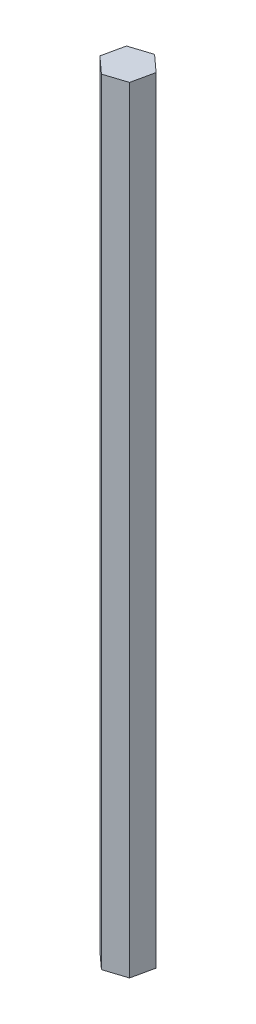
ISO-10303-21;
HEADER;
FILE_DESCRIPTION(('STEP AP214'),'2;1');
FILE_NAME('part.step','',(''),(''),'','','');
FILE_SCHEMA(('AUTOMOTIVE_DESIGN { 1 0 10303 214 1 1 1 1 }'));
ENDSEC;
DATA;
#1=APPLICATION_CONTEXT('core data for automotive mechanical design processes');
#2=APPLICATION_PROTOCOL_DEFINITION('international standard','automotive_design',2000,#1);
#3=PRODUCT_CONTEXT('',#1,'mechanical');
#4=PRODUCT('Part','Part','',(#3));
#5=PRODUCT_RELATED_PRODUCT_CATEGORY('part','',(#4));
#6=PRODUCT_DEFINITION_FORMATION('','',#4);
#7=PRODUCT_DEFINITION_CONTEXT('part definition',#1,'design');
#8=PRODUCT_DEFINITION('design','',#6,#7);
#9=PRODUCT_DEFINITION_SHAPE('','',#8);
#10=(LENGTH_UNIT() NAMED_UNIT(*) SI_UNIT(.MILLI.,.METRE.));
#11=(NAMED_UNIT(*) PLANE_ANGLE_UNIT() SI_UNIT($,.RADIAN.));
#12=(NAMED_UNIT(*) SI_UNIT($,.STERADIAN.) SOLID_ANGLE_UNIT());
#13=UNCERTAINTY_MEASURE_WITH_UNIT(LENGTH_MEASURE(1.E-05),#10,'distance_accuracy_value','');
#14=(GEOMETRIC_REPRESENTATION_CONTEXT(3) GLOBAL_UNCERTAINTY_ASSIGNED_CONTEXT((#13)) GLOBAL_UNIT_ASSIGNED_CONTEXT((#10,
#11,#12)) REPRESENTATION_CONTEXT('',''));
#15=CARTESIAN_POINT('',(0.,0.,0.));
#16=DIRECTION('',(0.,0.,1.));
#17=DIRECTION('',(1.,0.,0.));
#18=AXIS2_PLACEMENT_3D('',#15,#16,#17);
#19=CARTESIAN_POINT('',(-0.61182187926995,127.,2.82117126764399));
#20=DIRECTION('',(-0.305094633460301,0.,-0.952322038300976));
#21=DIRECTION('',(-0.952322038300976,0.,0.305094633460301));
#22=AXIS2_PLACEMENT_3D('',#19,#20,#21);
#23=PLANE('',#22);
#24=DIRECTION('',(0.,-1.,0.));
#25=VECTOR('',#24,1.);
#26=CARTESIAN_POINT('',(-0.61182187926995,127.,2.82117126764399));
#27=LINE('',#26,#25);
#28=CARTESIAN_POINT('',(-0.61182187926995,127.,2.82117126764399));
#29=VERTEX_POINT('',#28);
#30=CARTESIAN_POINT('',(-0.611821879270068,26.74,2.82117126764397));
#31=VERTEX_POINT('',#30);
#32=EDGE_CURVE('E148',#29,#31,#27,.T.);
#33=ORIENTED_EDGE('',*,*,#32,.T.);
#34=DIRECTION('',(-0.952322038300988,0.,0.305094633460263));
#35=VECTOR('',#34,1.);
#36=CARTESIAN_POINT('',(2.13729504657139,26.74,1.940438923861));
#37=LINE('',#36,#35);
#38=CARTESIAN_POINT('',(2.13729504657139,26.74,1.940438923861));
#39=VERTEX_POINT('',#38);
#40=EDGE_CURVE('E124',#39,#31,#37,.T.);
#41=ORIENTED_EDGE('',*,*,#40,.F.);
#42=DIRECTION('',(0.,-1.,0.));
#43=VECTOR('',#42,1.);
#44=CARTESIAN_POINT('',(2.13729504657146,127.,1.94043892386091));
#45=LINE('',#44,#43);
#46=CARTESIAN_POINT('',(2.13729504657146,127.,1.94043892386091));
#47=VERTEX_POINT('',#46);
#48=EDGE_CURVE('E11',#47,#39,#45,.T.);
#49=ORIENTED_EDGE('',*,*,#48,.F.);
#50=DIRECTION('',(0.952322038300976,0.,-0.305094633460301));
#51=VECTOR('',#50,1.);
#52=CARTESIAN_POINT('',(-0.61182187926995,127.,2.82117126764399));
#53=LINE('',#52,#51);
#54=EDGE_CURVE('E133',#29,#47,#53,.T.);
#55=ORIENTED_EDGE('',*,*,#54,.F.);
#56=EDGE_LOOP('',(#33,#41,#49,#55));
#57=FACE_BOUND('',#56,.T.);
#58=ADVANCED_FACE('F39',(#57),#23,.F.);
#59=CARTESIAN_POINT('',(2.13729504657146,127.,1.94043892386091));
#60=DIRECTION('',(-0.977282394482572,0.,-0.211941316015566));
#61=DIRECTION('',(-0.211941316015566,0.,0.977282394482572));
#62=AXIS2_PLACEMENT_3D('',#59,#60,#61);
#63=PLANE('',#62);
#64=ORIENTED_EDGE('',*,*,#48,.T.);
#65=DIRECTION('',(-0.211941316015604,0.,0.977282394482564));
#66=VECTOR('',#65,1.);
#67=CARTESIAN_POINT('',(2.74911692584146,26.74,-0.88073234378297));
#68=LINE('',#67,#66);
#69=CARTESIAN_POINT('',(2.74911692584146,26.74,-0.88073234378297));
#70=VERTEX_POINT('',#69);
#71=EDGE_CURVE('E112',#70,#39,#68,.T.);
#72=ORIENTED_EDGE('',*,*,#71,.F.);
#73=DIRECTION('',(0.,-1.,0.));
#74=VECTOR('',#73,1.);
#75=CARTESIAN_POINT('',(2.74911692584142,127.,-0.880732343783076));
#76=LINE('',#75,#74);
#77=CARTESIAN_POINT('',(2.74911692584142,127.,-0.880732343783076));
#78=VERTEX_POINT('',#77);
#79=EDGE_CURVE('E47',#78,#70,#76,.T.);
#80=ORIENTED_EDGE('',*,*,#79,.F.);
#81=DIRECTION('',(0.211941316015566,0.,-0.977282394482572));
#82=VECTOR('',#81,1.);
#83=CARTESIAN_POINT('',(2.13729504657146,127.,1.94043892386091));
#84=LINE('',#83,#82);
#85=EDGE_CURVE('E136',#47,#78,#84,.T.);
#86=ORIENTED_EDGE('',*,*,#85,.F.);
#87=EDGE_LOOP('',(#64,#72,#80,#86));
#88=FACE_BOUND('',#87,.T.);
#89=ADVANCED_FACE('F167',(#88),#63,.F.);
#90=CARTESIAN_POINT('',(2.74911692584142,127.,-0.880732343783076));
#91=DIRECTION('',(-0.672187761022271,0.,0.74038072228541));
#92=DIRECTION('',(0.74038072228541,0.,0.672187761022271));
#93=AXIS2_PLACEMENT_3D('',#90,#91,#92);
#94=PLANE('',#93);
#95=ORIENTED_EDGE('',*,*,#79,.T.);
#96=DIRECTION('',(0.740380722285383,0.,0.672187761022301));
#97=VECTOR('',#96,1.);
#98=CARTESIAN_POINT('',(0.611821879270067,26.74,-2.82117126764397));
#99=LINE('',#98,#97);
#100=CARTESIAN_POINT('',(0.611821879270067,26.74,-2.82117126764397));
#101=VERTEX_POINT('',#100);
#102=EDGE_CURVE('E105',#101,#70,#99,.T.);
#103=ORIENTED_EDGE('',*,*,#102,.F.);
#104=DIRECTION('',(0.,-1.,0.));
#105=VECTOR('',#104,1.);
#106=CARTESIAN_POINT('',(0.611821879269952,127.,-2.82117126764399));
#107=LINE('',#106,#105);
#108=CARTESIAN_POINT('',(0.611821879269952,127.,-2.82117126764399));
#109=VERTEX_POINT('',#108);
#110=EDGE_CURVE('E92',#109,#101,#107,.T.);
#111=ORIENTED_EDGE('',*,*,#110,.F.);
#112=DIRECTION('',(-0.74038072228541,0.,-0.672187761022271));
#113=VECTOR('',#112,1.);
#114=CARTESIAN_POINT('',(2.74911692584142,127.,-0.880732343783076));
#115=LINE('',#114,#113);
#116=EDGE_CURVE('E139',#78,#109,#115,.T.);
#117=ORIENTED_EDGE('',*,*,#116,.F.);
#118=EDGE_LOOP('',(#95,#103,#111,#117));
#119=FACE_BOUND('',#118,.T.);
#120=ADVANCED_FACE('F106',(#119),#94,.F.);
#121=CARTESIAN_POINT('',(0.611821879269952,127.,-2.82117126764399));
#122=DIRECTION('',(0.305094633460301,0.,0.952322038300975));
#123=DIRECTION('',(0.952322038300976,0.,-0.305094633460301));
#124=AXIS2_PLACEMENT_3D('',#121,#122,#123);
#125=PLANE('',#124);
#126=ORIENTED_EDGE('',*,*,#110,.T.);
#127=DIRECTION('',(0.952322038300987,0.,-0.305094633460263));
#128=VECTOR('',#127,1.);
#129=CARTESIAN_POINT('',(-2.13729504657139,26.74,-1.940438923861));
#130=LINE('',#129,#128);
#131=CARTESIAN_POINT('',(-2.13729504657139,26.74,-1.940438923861));
#132=VERTEX_POINT('',#131);
#133=EDGE_CURVE('E97',#132,#101,#130,.T.);
#134=ORIENTED_EDGE('',*,*,#133,.F.);
#135=DIRECTION('',(0.,-1.,0.));
#136=VECTOR('',#135,1.);
#137=CARTESIAN_POINT('',(-2.13729504657146,127.,-1.94043892386091));
#138=LINE('',#137,#136);
#139=CARTESIAN_POINT('',(-2.13729504657146,127.,-1.94043892386091));
#140=VERTEX_POINT('',#139);
#141=EDGE_CURVE('E102',#140,#132,#138,.T.);
#142=ORIENTED_EDGE('',*,*,#141,.F.);
#143=DIRECTION('',(-0.952322038300976,0.,0.305094633460301));
#144=VECTOR('',#143,1.);
#145=CARTESIAN_POINT('',(0.611821879269952,127.,-2.82117126764399));
#146=LINE('',#145,#144);
#147=EDGE_CURVE('E98',#109,#140,#146,.T.);
#148=ORIENTED_EDGE('',*,*,#147,.F.);
#149=EDGE_LOOP('',(#126,#134,#142,#148));
#150=FACE_BOUND('',#149,.T.);
#151=ADVANCED_FACE('F94',(#150),#125,.F.);
#152=CARTESIAN_POINT('',(-2.13729504657146,127.,-1.94043892386091));
#153=DIRECTION('',(0.977282394482573,0.,0.211941316015565));
#154=DIRECTION('',(0.211941316015565,0.,-0.977282394482573));
#155=AXIS2_PLACEMENT_3D('',#152,#153,#154);
#156=PLANE('',#155);
#157=ORIENTED_EDGE('',*,*,#141,.T.);
#158=DIRECTION('',(0.211941316015604,0.,-0.977282394482564));
#159=VECTOR('',#158,1.);
#160=CARTESIAN_POINT('',(-2.74911692584146,26.74,0.880732343782971));
#161=LINE('',#160,#159);
#162=CARTESIAN_POINT('',(-2.74911692584146,26.74,0.880732343782971));
#163=VERTEX_POINT('',#162);
#164=EDGE_CURVE('E118',#163,#132,#161,.T.);
#165=ORIENTED_EDGE('',*,*,#164,.F.);
#166=DIRECTION('',(0.,-1.,0.));
#167=VECTOR('',#166,1.);
#168=CARTESIAN_POINT('',(-2.74911692584141,127.,0.88073234378308));
#169=LINE('',#168,#167);
#170=CARTESIAN_POINT('',(-2.74911692584141,127.,0.88073234378308));
#171=VERTEX_POINT('',#170);
#172=EDGE_CURVE('E151',#171,#163,#169,.T.);
#173=ORIENTED_EDGE('',*,*,#172,.F.);
#174=DIRECTION('',(-0.211941316015565,0.,0.977282394482572));
#175=VECTOR('',#174,1.);
#176=CARTESIAN_POINT('',(-2.13729504657146,127.,-1.94043892386091));
#177=LINE('',#176,#175);
#178=EDGE_CURVE('E59',#140,#171,#177,.T.);
#179=ORIENTED_EDGE('',*,*,#178,.F.);
#180=EDGE_LOOP('',(#157,#165,#173,#179));
#181=FACE_BOUND('',#180,.T.);
#182=ADVANCED_FACE('F157',(#181),#156,.F.);
#183=CARTESIAN_POINT('',(-2.74911692584141,127.,0.88073234378308));
#184=DIRECTION('',(0.672187761022271,0.,-0.74038072228541));
#185=DIRECTION('',(-0.740380722285411,0.,-0.672187761022271));
#186=AXIS2_PLACEMENT_3D('',#183,#184,#185);
#187=PLANE('',#186);
#188=ORIENTED_EDGE('',*,*,#172,.T.);
#189=DIRECTION('',(-0.740380722285383,0.,-0.672187761022301));
#190=VECTOR('',#189,1.);
#191=CARTESIAN_POINT('',(-0.611821879270068,26.74,2.82117126764397));
#192=LINE('',#191,#190);
#193=EDGE_CURVE('E128',#31,#163,#192,.T.);
#194=ORIENTED_EDGE('',*,*,#193,.F.);
#195=ORIENTED_EDGE('',*,*,#32,.F.);
#196=DIRECTION('',(0.740380722285411,0.,0.672187761022271));
#197=VECTOR('',#196,1.);
#198=CARTESIAN_POINT('',(-2.74911692584141,127.,0.88073234378308));
#199=LINE('',#198,#197);
#200=EDGE_CURVE('E54',#171,#29,#199,.T.);
#201=ORIENTED_EDGE('',*,*,#200,.F.);
#202=EDGE_LOOP('',(#188,#194,#195,#201));
#203=FACE_BOUND('',#202,.T.);
#204=ADVANCED_FACE('F160',(#203),#187,.F.);
#205=CARTESIAN_POINT('',(0.,127.,0.));
#206=DIRECTION('',(0.,1.,0.));
#207=DIRECTION('',(0.,0.,1.));
#208=AXIS2_PLACEMENT_3D('',#205,#206,#207);
#209=PLANE('',#208);
#210=ORIENTED_EDGE('',*,*,#54,.T.);
#211=ORIENTED_EDGE('',*,*,#85,.T.);
#212=ORIENTED_EDGE('',*,*,#116,.T.);
#213=ORIENTED_EDGE('',*,*,#147,.T.);
#214=ORIENTED_EDGE('',*,*,#178,.T.);
#215=ORIENTED_EDGE('',*,*,#200,.T.);
#216=EDGE_LOOP('',(#210,#211,#212,#213,#214,#215));
#217=FACE_BOUND('',#216,.T.);
#218=ADVANCED_FACE('F165',(#217),#209,.T.);
#219=CARTESIAN_POINT('',(0.,26.74,0.));
#220=DIRECTION('',(0.,-1.,0.));
#221=DIRECTION('',(0.,0.,-1.));
#222=AXIS2_PLACEMENT_3D('',#219,#220,#221);
#223=PLANE('',#222);
#224=ORIENTED_EDGE('',*,*,#133,.T.);
#225=ORIENTED_EDGE('',*,*,#102,.T.);
#226=ORIENTED_EDGE('',*,*,#71,.T.);
#227=ORIENTED_EDGE('',*,*,#40,.T.);
#228=ORIENTED_EDGE('',*,*,#193,.T.);
#229=ORIENTED_EDGE('',*,*,#164,.T.);
#230=EDGE_LOOP('',(#224,#225,#226,#227,#228,#229));
#231=FACE_BOUND('',#230,.T.);
#232=ADVANCED_FACE('F115',(#231),#223,.T.);
#233=CLOSED_SHELL('',(#58,#89,#120,#151,#182,#204,#218,#232));
#234=MANIFOLD_SOLID_BREP('B2',#233);
#235=ADVANCED_BREP_SHAPE_REPRESENTATION('',(#18,#234),#14);
#236=SHAPE_DEFINITION_REPRESENTATION(#9,#235);
ENDSEC;
END-ISO-10303-21;
